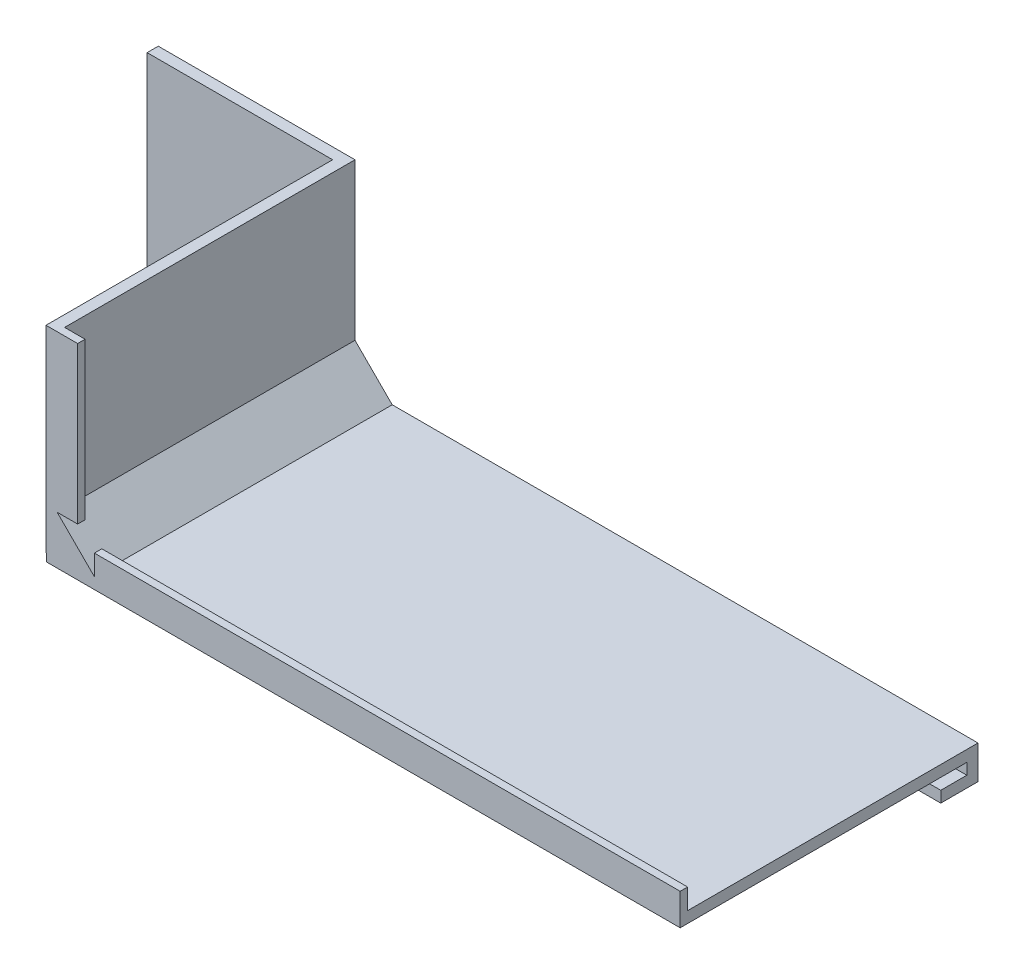
ISO-10303-21;
HEADER;
FILE_DESCRIPTION(('STEP AP214'),'2;1');
FILE_NAME('part.step','',(''),(''),'','','');
FILE_SCHEMA(('AUTOMOTIVE_DESIGN { 1 0 10303 214 1 1 1 1 }'));
ENDSEC;
DATA;
#1=APPLICATION_CONTEXT('core data for automotive mechanical design processes');
#2=APPLICATION_PROTOCOL_DEFINITION('international standard','automotive_design',2000,#1);
#3=PRODUCT_CONTEXT('',#1,'mechanical');
#4=PRODUCT('Part','Part','',(#3));
#5=PRODUCT_RELATED_PRODUCT_CATEGORY('part','',(#4));
#6=PRODUCT_DEFINITION_FORMATION('','',#4);
#7=PRODUCT_DEFINITION_CONTEXT('part definition',#1,'design');
#8=PRODUCT_DEFINITION('design','',#6,#7);
#9=PRODUCT_DEFINITION_SHAPE('','',#8);
#10=(LENGTH_UNIT() NAMED_UNIT(*) SI_UNIT(.MILLI.,.METRE.));
#11=(NAMED_UNIT(*) PLANE_ANGLE_UNIT() SI_UNIT($,.RADIAN.));
#12=(NAMED_UNIT(*) SI_UNIT($,.STERADIAN.) SOLID_ANGLE_UNIT());
#13=UNCERTAINTY_MEASURE_WITH_UNIT(LENGTH_MEASURE(1.E-05),#10,'distance_accuracy_value','');
#14=(GEOMETRIC_REPRESENTATION_CONTEXT(3) GLOBAL_UNCERTAINTY_ASSIGNED_CONTEXT((#13)) GLOBAL_UNIT_ASSIGNED_CONTEXT((#10,
#11,#12)) REPRESENTATION_CONTEXT('',''));
#15=CARTESIAN_POINT('',(0.,0.,0.));
#16=DIRECTION('',(0.,0.,1.));
#17=DIRECTION('',(1.,0.,0.));
#18=AXIS2_PLACEMENT_3D('',#15,#16,#17);
#19=CARTESIAN_POINT('',(0.,0.,-272.562777593547));
#20=DIRECTION('',(0.,0.,1.));
#21=DIRECTION('',(1.,0.,0.));
#22=AXIS2_PLACEMENT_3D('',#19,#20,#21);
#23=CYLINDRICAL_SURFACE('',#22,50.05);
#24=DIRECTION('',(0.,0.,1.));
#25=VECTOR('',#24,1.);
#26=CARTESIAN_POINT('',(49.7996234925526,-5.,-272.562777593547));
#27=LINE('',#26,#25);
#28=CARTESIAN_POINT('',(49.7996234925526,-5.,-131.));
#29=VERTEX_POINT('',#28);
#30=CARTESIAN_POINT('',(49.7996234925526,-5.,-128.));
#31=VERTEX_POINT('',#30);
#32=EDGE_CURVE('E408',#29,#31,#27,.T.);
#33=ORIENTED_EDGE('',*,*,#32,.T.);
#34=CARTESIAN_POINT('',(0.,0.,-128.));
#35=DIRECTION('',(0.,0.,-1.));
#36=DIRECTION('',(-1.,0.,0.));
#37=AXIS2_PLACEMENT_3D('',#34,#35,#36);
#38=CIRCLE('',#37,50.05);
#39=CARTESIAN_POINT('',(0.,-50.05,-128.));
#40=VERTEX_POINT('',#39);
#41=EDGE_CURVE('E204',#40,#31,#38,.F.);
#42=ORIENTED_EDGE('',*,*,#41,.F.);
#43=DIRECTION('',(0.,0.,1.));
#44=VECTOR('',#43,1.);
#45=CARTESIAN_POINT('',(0.,-50.05,-272.562777593547));
#46=LINE('',#45,#44);
#47=CARTESIAN_POINT('',(0.,-50.05,-131.));
#48=VERTEX_POINT('',#47);
#49=EDGE_CURVE('E57',#40,#48,#46,.F.);
#50=ORIENTED_EDGE('',*,*,#49,.T.);
#51=CARTESIAN_POINT('',(0.,0.,-131.));
#52=DIRECTION('',(0.,0.,-1.));
#53=DIRECTION('',(-1.,0.,0.));
#54=AXIS2_PLACEMENT_3D('',#51,#52,#53);
#55=CIRCLE('',#54,50.05);
#56=EDGE_CURVE('E211',#29,#48,#55,.T.);
#57=ORIENTED_EDGE('',*,*,#56,.F.);
#58=EDGE_LOOP('',(#33,#42,#50,#57));
#59=FACE_BOUND('',#58,.T.);
#60=ADVANCED_FACE('F48',(#59),#23,.T.);
#61=CARTESIAN_POINT('',(0.,4.,0.));
#62=DIRECTION('',(0.,-1.,0.));
#63=DIRECTION('',(0.,0.,-1.));
#64=AXIS2_PLACEMENT_3D('',#61,#62,#63);
#65=PLANE('',#64);
#66=DIRECTION('',(-1.,0.,0.));
#67=VECTOR('',#66,1.);
#68=CARTESIAN_POINT('',(0.,4.,-53.));
#69=LINE('',#68,#67);
#70=CARTESIAN_POINT('',(220.183732216023,4.,-53.));
#71=VERTEX_POINT('',#70);
#72=CARTESIAN_POINT('',(62.8397431775084,4.,-53.));
#73=VERTEX_POINT('',#72);
#74=EDGE_CURVE('E72',#71,#73,#69,.T.);
#75=ORIENTED_EDGE('',*,*,#74,.F.);
#76=DIRECTION('',(0.,0.,1.));
#77=VECTOR('',#76,1.);
#78=CARTESIAN_POINT('',(220.183732216023,4.,-9.99999999999999));
#79=LINE('',#78,#77);
#80=CARTESIAN_POINT('',(220.183732216023,4.,-131.));
#81=VERTEX_POINT('',#80);
#82=EDGE_CURVE('E240',#81,#71,#79,.T.);
#83=ORIENTED_EDGE('',*,*,#82,.F.);
#84=DIRECTION('',(1.,0.,0.));
#85=VECTOR('',#84,1.);
#86=CARTESIAN_POINT('',(39.7994974842648,4.,-131.));
#87=LINE('',#86,#85);
#88=CARTESIAN_POINT('',(62.8397431775084,4.,-131.));
#89=VERTEX_POINT('',#88);
#90=EDGE_CURVE('E236',#89,#81,#87,.T.);
#91=ORIENTED_EDGE('',*,*,#90,.F.);
#92=DIRECTION('',(0.,0.,1.));
#93=VECTOR('',#92,1.);
#94=CARTESIAN_POINT('',(62.8397431775084,4.,-11.5));
#95=LINE('',#94,#93);
#96=EDGE_CURVE('E247',#89,#73,#95,.T.);
#97=ORIENTED_EDGE('',*,*,#96,.T.);
#98=EDGE_LOOP('',(#75,#83,#91,#97));
#99=FACE_BOUND('',#98,.T.);
#100=ADVANCED_FACE('F381',(#99),#65,.F.);
#101=CARTESIAN_POINT('',(52.8397431775085,341.294854205715,134.));
#102=DIRECTION('',(-1.,0.,0.));
#103=DIRECTION('',(0.,0.,1.));
#104=AXIS2_PLACEMENT_3D('',#101,#102,#103);
#105=PLANE('',#104);
#106=DIRECTION('',(0.,1.,0.));
#107=VECTOR('',#106,1.);
#108=CARTESIAN_POINT('',(52.8397431775085,341.294854205715,-53.));
#109=LINE('',#108,#107);
#110=CARTESIAN_POINT('',(52.8397431775085,14.0000000000001,-53.));
#111=VERTEX_POINT('',#110);
#112=CARTESIAN_POINT('',(52.8397431775085,56.,-53.));
#113=VERTEX_POINT('',#112);
#114=EDGE_CURVE('E293',#111,#113,#109,.T.);
#115=ORIENTED_EDGE('',*,*,#114,.F.);
#116=DIRECTION('',(0.,0.,-1.));
#117=VECTOR('',#116,1.);
#118=CARTESIAN_POINT('',(52.8397431775085,14.0000000000001,-131.));
#119=LINE('',#118,#117);
#120=CARTESIAN_POINT('',(52.8397431775085,14.0000000000001,-131.));
#121=VERTEX_POINT('',#120);
#122=EDGE_CURVE('E243',#111,#121,#119,.T.);
#123=ORIENTED_EDGE('',*,*,#122,.T.);
#124=DIRECTION('',(0.,-1.,0.));
#125=VECTOR('',#124,1.);
#126=CARTESIAN_POINT('',(52.8397431775085,341.294854205715,-131.));
#127=LINE('',#126,#125);
#128=CARTESIAN_POINT('',(52.8397431775085,56.,-131.));
#129=VERTEX_POINT('',#128);
#130=EDGE_CURVE('E230',#129,#121,#127,.T.);
#131=ORIENTED_EDGE('',*,*,#130,.F.);
#132=DIRECTION('',(0.,0.,1.));
#133=VECTOR('',#132,1.);
#134=CARTESIAN_POINT('',(52.8397431775085,56.,134.));
#135=LINE('',#134,#133);
#136=EDGE_CURVE('E219',#129,#113,#135,.T.);
#137=ORIENTED_EDGE('',*,*,#136,.T.);
#138=EDGE_LOOP('',(#115,#123,#131,#137));
#139=FACE_BOUND('',#138,.T.);
#140=ADVANCED_FACE('F377',(#139),#105,.F.);
#141=CARTESIAN_POINT('',(0.,0.,-131.));
#142=DIRECTION('',(0.,0.,1.));
#143=DIRECTION('',(1.,0.,0.));
#144=AXIS2_PLACEMENT_3D('',#141,#142,#143);
#145=CYLINDRICAL_SURFACE('',#144,50.);
#146=CARTESIAN_POINT('',(0.,0.,-128.));
#147=DIRECTION('',(0.,0.,-1.));
#148=DIRECTION('',(-1.,0.,0.));
#149=AXIS2_PLACEMENT_3D('',#146,#147,#148);
#150=CIRCLE('',#149,50.);
#151=CARTESIAN_POINT('',(49.749371855331,-5.,-128.));
#152=VERTEX_POINT('',#151);
#153=CARTESIAN_POINT('',(49.9599839871872,-2.,-128.));
#154=VERTEX_POINT('',#153);
#155=EDGE_CURVE('E201',#152,#154,#150,.F.);
#156=ORIENTED_EDGE('',*,*,#155,.F.);
#157=DIRECTION('',(0.,0.,1.));
#158=VECTOR('',#157,1.);
#159=CARTESIAN_POINT('',(49.749371855331,-5.,-131.));
#160=LINE('',#159,#158);
#161=CARTESIAN_POINT('',(49.749371855331,-5.,-121.));
#162=VERTEX_POINT('',#161);
#163=EDGE_CURVE('E188',#152,#162,#160,.T.);
#164=ORIENTED_EDGE('',*,*,#163,.T.);
#165=CARTESIAN_POINT('',(0.,0.,-121.));
#166=DIRECTION('',(0.,0.,-1.));
#167=DIRECTION('',(1.,0.,0.));
#168=AXIS2_PLACEMENT_3D('',#165,#166,#167);
#169=CIRCLE('',#168,50.);
#170=CARTESIAN_POINT('',(49.9599839871872,-2.,-121.));
#171=VERTEX_POINT('',#170);
#172=EDGE_CURVE('E396',#171,#162,#169,.T.);
#173=ORIENTED_EDGE('',*,*,#172,.F.);
#174=DIRECTION('',(0.,0.,1.));
#175=VECTOR('',#174,1.);
#176=CARTESIAN_POINT('',(49.9599839871872,-2.,-131.));
#177=LINE('',#176,#175);
#178=EDGE_CURVE('E208',#171,#154,#177,.F.);
#179=ORIENTED_EDGE('',*,*,#178,.T.);
#180=EDGE_LOOP('',(#156,#164,#173,#179));
#181=FACE_BOUND('',#180,.T.);
#182=ADVANCED_FACE('F206',(#181),#145,.F.);
#183=DIRECTION('',(0.,0.,1.));
#184=VECTOR('',#183,1.);
#185=CARTESIAN_POINT('',(49.9899989998,1.,-131.));
#186=LINE('',#185,#184);
#187=CARTESIAN_POINT('',(49.9899989998,1.,-128.));
#188=VERTEX_POINT('',#187);
#189=CARTESIAN_POINT('',(49.9899989998,1.,-51.));
#190=VERTEX_POINT('',#189);
#191=EDGE_CURVE('E263',#188,#190,#186,.T.);
#192=ORIENTED_EDGE('',*,*,#191,.T.);
#193=CARTESIAN_POINT('',(0.,0.,-51.));
#194=DIRECTION('',(0.,0.,-1.));
#195=DIRECTION('',(0.,1.,0.));
#196=AXIS2_PLACEMENT_3D('',#193,#194,#195);
#197=CIRCLE('',#196,50.);
#198=CARTESIAN_POINT('',(49.8397431775085,4.,-51.));
#199=VERTEX_POINT('',#198);
#200=EDGE_CURVE('E286',#190,#199,#197,.F.);
#201=ORIENTED_EDGE('',*,*,#200,.T.);
#202=DIRECTION('',(0.,0.,1.));
#203=VECTOR('',#202,1.);
#204=CARTESIAN_POINT('',(49.8397431775085,4.,131.));
#205=LINE('',#204,#203);
#206=CARTESIAN_POINT('',(49.8397431775085,4.,-128.));
#207=VERTEX_POINT('',#206);
#208=EDGE_CURVE('E213',#207,#199,#205,.T.);
#209=ORIENTED_EDGE('',*,*,#208,.F.);
#210=EDGE_CURVE('E210',#188,#207,#150,.F.);
#211=ORIENTED_EDGE('',*,*,#210,.F.);
#212=EDGE_LOOP('',(#192,#201,#209,#211));
#213=FACE_BOUND('',#212,.T.);
#214=ADVANCED_FACE('F285',(#213),#145,.F.);
#215=CARTESIAN_POINT('',(49.8397431775085,341.294854205715,131.));
#216=DIRECTION('',(1.,0.,0.));
#217=DIRECTION('',(0.,0.,-1.));
#218=AXIS2_PLACEMENT_3D('',#215,#216,#217);
#219=PLANE('',#218);
#220=ORIENTED_EDGE('',*,*,#208,.T.);
#221=DIRECTION('',(0.,1.,0.));
#222=VECTOR('',#221,1.);
#223=CARTESIAN_POINT('',(49.8397431775085,341.294854205715,-51.));
#224=LINE('',#223,#222);
#225=CARTESIAN_POINT('',(49.8397431775085,56.,-51.));
#226=VERTEX_POINT('',#225);
#227=EDGE_CURVE('E288',#199,#226,#224,.T.);
#228=ORIENTED_EDGE('',*,*,#227,.T.);
#229=DIRECTION('',(0.,0.,-1.));
#230=VECTOR('',#229,1.);
#231=CARTESIAN_POINT('',(49.8397431775085,56.,131.));
#232=LINE('',#231,#230);
#233=CARTESIAN_POINT('',(49.8397431775085,56.,-128.));
#234=VERTEX_POINT('',#233);
#235=EDGE_CURVE('E222',#226,#234,#232,.T.);
#236=ORIENTED_EDGE('',*,*,#235,.T.);
#237=DIRECTION('',(0.,-1.,0.));
#238=VECTOR('',#237,1.);
#239=CARTESIAN_POINT('',(49.8397431775084,341.294854205715,-128.));
#240=LINE('',#239,#238);
#241=EDGE_CURVE('E220',#234,#207,#240,.T.);
#242=ORIENTED_EDGE('',*,*,#241,.T.);
#243=EDGE_LOOP('',(#220,#228,#236,#242));
#244=FACE_BOUND('',#243,.T.);
#245=ADVANCED_FACE('F281',(#244),#219,.F.);
#246=CARTESIAN_POINT('',(220.183732216023,4.,-9.99999999999999));
#247=DIRECTION('',(1.,0.,0.));
#248=DIRECTION('',(0.,0.,-1.));
#249=AXIS2_PLACEMENT_3D('',#246,#247,#248);
#250=PLANE('',#249);
#251=DIRECTION('',(0.,0.,1.));
#252=VECTOR('',#251,1.);
#253=CARTESIAN_POINT('',(220.183732216023,-5.,-121.));
#254=LINE('',#253,#252);
#255=CARTESIAN_POINT('',(220.183732216023,-5.,-131.));
#256=VERTEX_POINT('',#255);
#257=CARTESIAN_POINT('',(220.183732216023,-5.,-121.));
#258=VERTEX_POINT('',#257);
#259=EDGE_CURVE('E196',#256,#258,#254,.T.);
#260=ORIENTED_EDGE('',*,*,#259,.F.);
#261=DIRECTION('',(0.,-1.,0.));
#262=VECTOR('',#261,1.);
#263=CARTESIAN_POINT('',(220.183732216023,4.,-131.));
#264=LINE('',#263,#262);
#265=EDGE_CURVE('E237',#81,#256,#264,.T.);
#266=ORIENTED_EDGE('',*,*,#265,.F.);
#267=ORIENTED_EDGE('',*,*,#82,.T.);
#268=DIRECTION('',(0.,1.,0.));
#269=VECTOR('',#268,1.);
#270=CARTESIAN_POINT('',(220.183732216023,2.5,-53.));
#271=LINE('',#270,#269);
#272=CARTESIAN_POINT('',(220.183732216023,9.5,-53.));
#273=VERTEX_POINT('',#272);
#274=EDGE_CURVE('E326',#71,#273,#271,.T.);
#275=ORIENTED_EDGE('',*,*,#274,.T.);
#276=DIRECTION('',(0.,0.,1.));
#277=VECTOR('',#276,1.);
#278=CARTESIAN_POINT('',(220.183732216023,9.5,-53.));
#279=LINE('',#278,#277);
#280=CARTESIAN_POINT('',(220.183732216023,9.5,-51.));
#281=VERTEX_POINT('',#280);
#282=EDGE_CURVE('E314',#273,#281,#279,.T.);
#283=ORIENTED_EDGE('',*,*,#282,.T.);
#284=DIRECTION('',(0.,1.,0.));
#285=VECTOR('',#284,1.);
#286=CARTESIAN_POINT('',(220.183732216023,84.2150551607094,-51.));
#287=LINE('',#286,#285);
#288=CARTESIAN_POINT('',(220.183732216023,1.,-51.));
#289=VERTEX_POINT('',#288);
#290=EDGE_CURVE('E289',#289,#281,#287,.T.);
#291=ORIENTED_EDGE('',*,*,#290,.F.);
#292=DIRECTION('',(0.,0.,1.));
#293=VECTOR('',#292,1.);
#294=CARTESIAN_POINT('',(220.183732216023,1.,131.));
#295=LINE('',#294,#293);
#296=CARTESIAN_POINT('',(220.183732216023,1.,-128.));
#297=VERTEX_POINT('',#296);
#298=EDGE_CURVE('E300',#297,#289,#295,.T.);
#299=ORIENTED_EDGE('',*,*,#298,.F.);
#300=DIRECTION('',(0.,1.,0.));
#301=VECTOR('',#300,1.);
#302=CARTESIAN_POINT('',(220.183732216023,-5.,-128.));
#303=LINE('',#302,#301);
#304=CARTESIAN_POINT('',(220.183732216023,-2.,-128.));
#305=VERTEX_POINT('',#304);
#306=EDGE_CURVE('E227',#305,#297,#303,.T.);
#307=ORIENTED_EDGE('',*,*,#306,.F.);
#308=DIRECTION('',(0.,0.,1.));
#309=VECTOR('',#308,1.);
#310=CARTESIAN_POINT('',(220.183732216023,-2.,-128.));
#311=LINE('',#310,#309);
#312=CARTESIAN_POINT('',(220.183732216023,-2.,-121.));
#313=VERTEX_POINT('',#312);
#314=EDGE_CURVE('E402',#305,#313,#311,.T.);
#315=ORIENTED_EDGE('',*,*,#314,.T.);
#316=DIRECTION('',(0.,1.,0.));
#317=VECTOR('',#316,1.);
#318=CARTESIAN_POINT('',(220.183732216023,-6.,-121.));
#319=LINE('',#318,#317);
#320=EDGE_CURVE('E393',#258,#313,#319,.T.);
#321=ORIENTED_EDGE('',*,*,#320,.F.);
#322=EDGE_LOOP('',(#260,#266,#267,#275,#283,#291,#299,#307,#315,#321));
#323=FACE_BOUND('',#322,.T.);
#324=ADVANCED_FACE('F310',(#323),#250,.T.);
#325=CARTESIAN_POINT('',(0.,0.,-131.));
#326=DIRECTION('',(0.,0.,-1.));
#327=DIRECTION('',(-1.,0.,0.));
#328=AXIS2_PLACEMENT_3D('',#325,#326,#327);
#329=PLANE('',#328);
#330=DIRECTION('',(1.,0.,0.));
#331=VECTOR('',#330,1.);
#332=CARTESIAN_POINT('',(-0.001000000000001,-5.,-131.));
#333=LINE('',#332,#331);
#334=EDGE_CURVE('E406',#29,#256,#333,.T.);
#335=ORIENTED_EDGE('',*,*,#334,.F.);
#336=ORIENTED_EDGE('',*,*,#56,.T.);
#337=DIRECTION('',(0.,1.,0.));
#338=VECTOR('',#337,1.);
#339=CARTESIAN_POINT('',(0.,74.9278312200649,-131.));
#340=LINE('',#339,#338);
#341=CARTESIAN_POINT('',(0.,56.,-131.));
#342=VERTEX_POINT('',#341);
#343=EDGE_CURVE('E259',#48,#342,#340,.T.);
#344=ORIENTED_EDGE('',*,*,#343,.T.);
#345=DIRECTION('',(1.,0.,0.));
#346=VECTOR('',#345,1.);
#347=CARTESIAN_POINT('',(-52.8397431775085,56.,-131.));
#348=LINE('',#347,#346);
#349=EDGE_CURVE('E217',#342,#129,#348,.T.);
#350=ORIENTED_EDGE('',*,*,#349,.T.);
#351=ORIENTED_EDGE('',*,*,#130,.T.);
#352=DIRECTION('',(-0.707106781186543,0.707106781186552,0.));
#353=VECTOR('',#352,1.);
#354=CARTESIAN_POINT('',(52.8397431775085,14.0000000000001,-131.));
#355=LINE('',#354,#353);
#356=EDGE_CURVE('E249',#121,#89,#355,.F.);
#357=ORIENTED_EDGE('',*,*,#356,.T.);
#358=ORIENTED_EDGE('',*,*,#90,.T.);
#359=ORIENTED_EDGE('',*,*,#265,.T.);
#360=EDGE_LOOP('',(#335,#336,#344,#350,#351,#357,#358,#359));
#361=FACE_BOUND('',#360,.T.);
#362=ADVANCED_FACE('F379',(#361),#329,.T.);
#363=CARTESIAN_POINT('',(220.183732216023,-5.,-128.));
#364=DIRECTION('',(0.,0.,-1.));
#365=DIRECTION('',(-1.,0.,0.));
#366=AXIS2_PLACEMENT_3D('',#363,#364,#365);
#367=PLANE('',#366);
#368=DIRECTION('',(1.,0.,0.));
#369=VECTOR('',#368,1.);
#370=CARTESIAN_POINT('',(51.7652841898553,-5.,-128.));
#371=LINE('',#370,#369);
#372=EDGE_CURVE('E192',#152,#31,#371,.T.);
#373=ORIENTED_EDGE('',*,*,#372,.F.);
#374=ORIENTED_EDGE('',*,*,#155,.T.);
#375=DIRECTION('',(1.,0.,0.));
#376=VECTOR('',#375,1.);
#377=CARTESIAN_POINT('',(-0.001000000000001,-2.,-128.));
#378=LINE('',#377,#376);
#379=EDGE_CURVE('E400',#154,#305,#378,.T.);
#380=ORIENTED_EDGE('',*,*,#379,.T.);
#381=ORIENTED_EDGE('',*,*,#306,.T.);
#382=DIRECTION('',(1.,0.,0.));
#383=VECTOR('',#382,1.);
#384=CARTESIAN_POINT('',(0.,1.,-128.));
#385=LINE('',#384,#383);
#386=EDGE_CURVE('E267',#188,#297,#385,.T.);
#387=ORIENTED_EDGE('',*,*,#386,.F.);
#388=ORIENTED_EDGE('',*,*,#210,.T.);
#389=ORIENTED_EDGE('',*,*,#241,.F.);
#390=DIRECTION('',(-1.,0.,0.));
#391=VECTOR('',#390,1.);
#392=CARTESIAN_POINT('',(-49.8397431775085,56.,-128.));
#393=LINE('',#392,#391);
#394=CARTESIAN_POINT('',(0.,56.,-128.));
#395=VERTEX_POINT('',#394);
#396=EDGE_CURVE('E224',#234,#395,#393,.T.);
#397=ORIENTED_EDGE('',*,*,#396,.T.);
#398=DIRECTION('',(0.,-1.,0.));
#399=VECTOR('',#398,1.);
#400=CARTESIAN_POINT('',(0.,-5.,-128.));
#401=LINE('',#400,#399);
#402=EDGE_CURVE('E256',#395,#40,#401,.T.);
#403=ORIENTED_EDGE('',*,*,#402,.T.);
#404=ORIENTED_EDGE('',*,*,#41,.T.);
#405=EDGE_LOOP('',(#373,#374,#380,#381,#387,#388,#389,#397,#403,#404));
#406=FACE_BOUND('',#405,.T.);
#407=ADVANCED_FACE('F199',(#406),#367,.F.);
#408=CARTESIAN_POINT('',(42.9502503121069,56.,234.437492999377));
#409=DIRECTION('',(0.,-1.,0.));
#410=DIRECTION('',(0.,0.,-1.));
#411=AXIS2_PLACEMENT_3D('',#408,#409,#410);
#412=PLANE('',#411);
#413=DIRECTION('',(1.,0.,0.));
#414=VECTOR('',#413,1.);
#415=CARTESIAN_POINT('',(42.9502503121069,56.,-51.));
#416=LINE('',#415,#414);
#417=CARTESIAN_POINT('',(58.3397431775085,56.,-51.));
#418=VERTEX_POINT('',#417);
#419=EDGE_CURVE('E291',#226,#418,#416,.T.);
#420=ORIENTED_EDGE('',*,*,#419,.T.);
#421=DIRECTION('',(0.,0.,1.));
#422=VECTOR('',#421,1.);
#423=CARTESIAN_POINT('',(58.3397431775085,56.,-53.));
#424=LINE('',#423,#422);
#425=CARTESIAN_POINT('',(58.3397431775085,56.,-53.));
#426=VERTEX_POINT('',#425);
#427=EDGE_CURVE('E352',#426,#418,#424,.T.);
#428=ORIENTED_EDGE('',*,*,#427,.F.);
#429=DIRECTION('',(-1.,0.,0.));
#430=VECTOR('',#429,1.);
#431=CARTESIAN_POINT('',(51.3397431775085,56.,-53.));
#432=LINE('',#431,#430);
#433=EDGE_CURVE('E345',#426,#113,#432,.T.);
#434=ORIENTED_EDGE('',*,*,#433,.T.);
#435=ORIENTED_EDGE('',*,*,#136,.F.);
#436=ORIENTED_EDGE('',*,*,#349,.F.);
#437=DIRECTION('',(0.,0.,1.));
#438=VECTOR('',#437,1.);
#439=CARTESIAN_POINT('',(0.,56.,234.437492999377));
#440=LINE('',#439,#438);
#441=EDGE_CURVE('E260',#342,#395,#440,.T.);
#442=ORIENTED_EDGE('',*,*,#441,.T.);
#443=ORIENTED_EDGE('',*,*,#396,.F.);
#444=ORIENTED_EDGE('',*,*,#235,.F.);
#445=EDGE_LOOP('',(#420,#428,#434,#435,#436,#442,#443,#444));
#446=FACE_BOUND('',#445,.T.);
#447=ADVANCED_FACE('F273',(#446),#412,.F.);
#448=CARTESIAN_POINT('',(52.8397431775085,14.0000000000001,134.));
#449=DIRECTION('',(0.707106781186552,0.707106781186543,0.));
#450=DIRECTION('',(0.,0.,1.));
#451=AXIS2_PLACEMENT_3D('',#448,#449,#450);
#452=PLANE('',#451);
#453=CARTESIAN_POINT('',(52.8397431775085,14.0000000000001,-51.));
#454=VERTEX_POINT('',#453);
#455=EDGE_CURVE('E244',#454,#111,#119,.T.);
#456=ORIENTED_EDGE('',*,*,#455,.F.);
#457=DIRECTION('',(-0.707106781186543,0.707106781186552,0.));
#458=VECTOR('',#457,1.);
#459=CARTESIAN_POINT('',(52.8397431775085,14.0000000000001,-51.));
#460=LINE('',#459,#458);
#461=CARTESIAN_POINT('',(62.8397432160231,3.9999999614853,-51.));
#462=VERTEX_POINT('',#461);
#463=EDGE_CURVE('E298',#454,#462,#460,.F.);
#464=ORIENTED_EDGE('',*,*,#463,.T.);
#465=DIRECTION('',(0.,0.,1.));
#466=VECTOR('',#465,1.);
#467=CARTESIAN_POINT('',(62.8397432160231,3.99999996148531,134.));
#468=LINE('',#467,#466);
#469=EDGE_CURVE('E323',#462,#73,#468,.F.);
#470=ORIENTED_EDGE('',*,*,#469,.T.);
#471=ORIENTED_EDGE('',*,*,#96,.F.);
#472=ORIENTED_EDGE('',*,*,#356,.F.);
#473=ORIENTED_EDGE('',*,*,#122,.F.);
#474=EDGE_LOOP('',(#456,#464,#470,#471,#472,#473));
#475=FACE_BOUND('',#474,.T.);
#476=ADVANCED_FACE('F51',(#475),#452,.T.);
#477=CARTESIAN_POINT('',(0.,74.9278312200649,-131.));
#478=DIRECTION('',(1.,0.,0.));
#479=DIRECTION('',(0.,0.,-1.));
#480=AXIS2_PLACEMENT_3D('',#477,#478,#479);
#481=PLANE('',#480);
#482=ORIENTED_EDGE('',*,*,#343,.F.);
#483=ORIENTED_EDGE('',*,*,#49,.F.);
#484=ORIENTED_EDGE('',*,*,#402,.F.);
#485=ORIENTED_EDGE('',*,*,#441,.F.);
#486=EDGE_LOOP('',(#482,#483,#484,#485));
#487=FACE_BOUND('',#486,.T.);
#488=ADVANCED_FACE('F255',(#487),#481,.F.);
#489=CARTESIAN_POINT('',(0.,1.,131.));
#490=DIRECTION('',(0.,1.,0.));
#491=DIRECTION('',(0.,0.,1.));
#492=AXIS2_PLACEMENT_3D('',#489,#490,#491);
#493=PLANE('',#492);
#494=ORIENTED_EDGE('',*,*,#298,.T.);
#495=DIRECTION('',(-1.,0.,0.));
#496=VECTOR('',#495,1.);
#497=CARTESIAN_POINT('',(0.,1.,-51.));
#498=LINE('',#497,#496);
#499=EDGE_CURVE('E13',#289,#190,#498,.T.);
#500=ORIENTED_EDGE('',*,*,#499,.T.);
#501=ORIENTED_EDGE('',*,*,#191,.F.);
#502=ORIENTED_EDGE('',*,*,#386,.T.);
#503=EDGE_LOOP('',(#494,#500,#501,#502));
#504=FACE_BOUND('',#503,.T.);
#505=ADVANCED_FACE('F305',(#504),#493,.F.);
#506=CARTESIAN_POINT('',(-41.8162677839768,84.2150551607094,-51.));
#507=DIRECTION('',(0.,0.,-1.));
#508=DIRECTION('',(0.,1.,0.));
#509=AXIS2_PLACEMENT_3D('',#506,#507,#508);
#510=PLANE('',#509);
#511=ORIENTED_EDGE('',*,*,#290,.T.);
#512=DIRECTION('',(-1.,0.,0.));
#513=VECTOR('',#512,1.);
#514=CARTESIAN_POINT('',(220.183732216023,9.5,-51.));
#515=LINE('',#514,#513);
#516=CARTESIAN_POINT('',(62.8397432160231,9.49999999999998,-51.));
#517=VERTEX_POINT('',#516);
#518=EDGE_CURVE('E319',#281,#517,#515,.T.);
#519=ORIENTED_EDGE('',*,*,#518,.T.);
#520=DIRECTION('',(0.,-1.,0.));
#521=VECTOR('',#520,1.);
#522=CARTESIAN_POINT('',(62.8397432160231,2.49999999999998,-51.));
#523=LINE('',#522,#521);
#524=EDGE_CURVE('E321',#517,#462,#523,.T.);
#525=ORIENTED_EDGE('',*,*,#524,.T.);
#526=ORIENTED_EDGE('',*,*,#463,.F.);
#527=DIRECTION('',(1.,0.,0.));
#528=VECTOR('',#527,1.);
#529=CARTESIAN_POINT('',(51.3397431775085,14.0000000000001,-51.));
#530=LINE('',#529,#528);
#531=CARTESIAN_POINT('',(58.3397431775085,14.0000000000001,-51.));
#532=VERTEX_POINT('',#531);
#533=EDGE_CURVE('E338',#454,#532,#530,.T.);
#534=ORIENTED_EDGE('',*,*,#533,.T.);
#535=DIRECTION('',(0.,1.,0.));
#536=VECTOR('',#535,1.);
#537=CARTESIAN_POINT('',(58.3397431775085,56.,-51.));
#538=LINE('',#537,#536);
#539=EDGE_CURVE('E342',#532,#418,#538,.T.);
#540=ORIENTED_EDGE('',*,*,#539,.T.);
#541=ORIENTED_EDGE('',*,*,#419,.F.);
#542=ORIENTED_EDGE('',*,*,#227,.F.);
#543=ORIENTED_EDGE('',*,*,#200,.F.);
#544=ORIENTED_EDGE('',*,*,#499,.F.);
#545=EDGE_LOOP('',(#511,#519,#525,#526,#534,#540,#541,#542,#543,#544));
#546=FACE_BOUND('',#545,.T.);
#547=ADVANCED_FACE('F317',(#546),#510,.F.);
#548=CARTESIAN_POINT('',(0.,0.,-53.));
#549=DIRECTION('',(0.,0.,1.));
#550=DIRECTION('',(1.,0.,0.));
#551=AXIS2_PLACEMENT_3D('',#548,#549,#550);
#552=PLANE('',#551);
#553=DIRECTION('',(1.,0.,0.));
#554=VECTOR('',#553,1.);
#555=CARTESIAN_POINT('',(51.3397431775085,14.0000000000001,-53.));
#556=LINE('',#555,#554);
#557=CARTESIAN_POINT('',(58.3397431775085,14.0000000000001,-53.));
#558=VERTEX_POINT('',#557);
#559=EDGE_CURVE('E339',#111,#558,#556,.T.);
#560=ORIENTED_EDGE('',*,*,#559,.F.);
#561=ORIENTED_EDGE('',*,*,#114,.T.);
#562=ORIENTED_EDGE('',*,*,#433,.F.);
#563=DIRECTION('',(0.,1.,0.));
#564=VECTOR('',#563,1.);
#565=CARTESIAN_POINT('',(58.3397431775085,56.,-53.));
#566=LINE('',#565,#564);
#567=EDGE_CURVE('E341',#558,#426,#566,.T.);
#568=ORIENTED_EDGE('',*,*,#567,.F.);
#569=EDGE_LOOP('',(#560,#561,#562,#568));
#570=FACE_BOUND('',#569,.T.);
#571=ADVANCED_FACE('F361',(#570),#552,.F.);
#572=CARTESIAN_POINT('',(51.3397431775085,14.0000000000001,-53.));
#573=DIRECTION('',(0.,-1.,0.));
#574=DIRECTION('',(0.,0.,-1.));
#575=AXIS2_PLACEMENT_3D('',#572,#573,#574);
#576=PLANE('',#575);
#577=ORIENTED_EDGE('',*,*,#455,.T.);
#578=ORIENTED_EDGE('',*,*,#559,.T.);
#579=DIRECTION('',(0.,0.,1.));
#580=VECTOR('',#579,1.);
#581=CARTESIAN_POINT('',(58.3397431775085,14.0000000000001,-53.));
#582=LINE('',#581,#580);
#583=EDGE_CURVE('E348',#558,#532,#582,.T.);
#584=ORIENTED_EDGE('',*,*,#583,.T.);
#585=ORIENTED_EDGE('',*,*,#533,.F.);
#586=EDGE_LOOP('',(#577,#578,#584,#585));
#587=FACE_BOUND('',#586,.T.);
#588=ADVANCED_FACE('F371',(#587),#576,.T.);
#589=CARTESIAN_POINT('',(58.3397431775085,56.,-53.));
#590=DIRECTION('',(1.,0.,0.));
#591=DIRECTION('',(0.,0.,-1.));
#592=AXIS2_PLACEMENT_3D('',#589,#590,#591);
#593=PLANE('',#592);
#594=ORIENTED_EDGE('',*,*,#539,.F.);
#595=ORIENTED_EDGE('',*,*,#583,.F.);
#596=ORIENTED_EDGE('',*,*,#567,.T.);
#597=ORIENTED_EDGE('',*,*,#427,.T.);
#598=EDGE_LOOP('',(#594,#595,#596,#597));
#599=FACE_BOUND('',#598,.T.);
#600=ADVANCED_FACE('F368',(#599),#593,.T.);
#601=CARTESIAN_POINT('',(0.,0.,-53.));
#602=DIRECTION('',(0.,0.,1.));
#603=DIRECTION('',(1.,0.,0.));
#604=AXIS2_PLACEMENT_3D('',#601,#602,#603);
#605=PLANE('',#604);
#606=ORIENTED_EDGE('',*,*,#274,.F.);
#607=ORIENTED_EDGE('',*,*,#74,.T.);
#608=DIRECTION('',(0.,-1.,0.));
#609=VECTOR('',#608,1.);
#610=CARTESIAN_POINT('',(62.8397432160231,2.49999999999998,-53.));
#611=LINE('',#610,#609);
#612=CARTESIAN_POINT('',(62.8397432160231,9.49999999999998,-53.));
#613=VERTEX_POINT('',#612);
#614=EDGE_CURVE('E330',#613,#73,#611,.T.);
#615=ORIENTED_EDGE('',*,*,#614,.F.);
#616=DIRECTION('',(-1.,0.,0.));
#617=VECTOR('',#616,1.);
#618=CARTESIAN_POINT('',(220.183732216023,9.5,-53.));
#619=LINE('',#618,#617);
#620=EDGE_CURVE('E333',#273,#613,#619,.T.);
#621=ORIENTED_EDGE('',*,*,#620,.F.);
#622=EDGE_LOOP('',(#606,#607,#615,#621));
#623=FACE_BOUND('',#622,.T.);
#624=ADVANCED_FACE('F390',(#623),#605,.F.);
#625=CARTESIAN_POINT('',(62.8397432160231,2.49999999999998,-53.));
#626=DIRECTION('',(-1.,0.,0.));
#627=DIRECTION('',(0.,0.,1.));
#628=AXIS2_PLACEMENT_3D('',#625,#626,#627);
#629=PLANE('',#628);
#630=ORIENTED_EDGE('',*,*,#469,.F.);
#631=ORIENTED_EDGE('',*,*,#524,.F.);
#632=DIRECTION('',(0.,0.,1.));
#633=VECTOR('',#632,1.);
#634=CARTESIAN_POINT('',(62.8397432160231,9.49999999999998,-53.));
#635=LINE('',#634,#633);
#636=EDGE_CURVE('E386',#613,#517,#635,.T.);
#637=ORIENTED_EDGE('',*,*,#636,.F.);
#638=ORIENTED_EDGE('',*,*,#614,.T.);
#639=EDGE_LOOP('',(#630,#631,#637,#638));
#640=FACE_BOUND('',#639,.T.);
#641=ADVANCED_FACE('F384',(#640),#629,.T.);
#642=CARTESIAN_POINT('',(220.183732216023,9.5,-53.));
#643=DIRECTION('',(0.,1.,0.));
#644=DIRECTION('',(-1.,0.,0.));
#645=AXIS2_PLACEMENT_3D('',#642,#643,#644);
#646=PLANE('',#645);
#647=ORIENTED_EDGE('',*,*,#518,.F.);
#648=ORIENTED_EDGE('',*,*,#282,.F.);
#649=ORIENTED_EDGE('',*,*,#620,.T.);
#650=ORIENTED_EDGE('',*,*,#636,.T.);
#651=EDGE_LOOP('',(#647,#648,#649,#650));
#652=FACE_BOUND('',#651,.T.);
#653=ADVANCED_FACE('F391',(#652),#646,.T.);
#654=CARTESIAN_POINT('',(0.,0.,-121.));
#655=DIRECTION('',(0.,0.,1.));
#656=DIRECTION('',(1.,0.,0.));
#657=AXIS2_PLACEMENT_3D('',#654,#655,#656);
#658=PLANE('',#657);
#659=ORIENTED_EDGE('',*,*,#172,.T.);
#660=DIRECTION('',(1.,0.,0.));
#661=VECTOR('',#660,1.);
#662=CARTESIAN_POINT('',(-0.001000000000001,-5.,-121.));
#663=LINE('',#662,#661);
#664=EDGE_CURVE('E64',#162,#258,#663,.T.);
#665=ORIENTED_EDGE('',*,*,#664,.T.);
#666=ORIENTED_EDGE('',*,*,#320,.T.);
#667=DIRECTION('',(1.,0.,0.));
#668=VECTOR('',#667,1.);
#669=CARTESIAN_POINT('',(-0.001000000000001,-2.,-121.));
#670=LINE('',#669,#668);
#671=EDGE_CURVE('E399',#171,#313,#670,.T.);
#672=ORIENTED_EDGE('',*,*,#671,.F.);
#673=EDGE_LOOP('',(#659,#665,#666,#672));
#674=FACE_BOUND('',#673,.T.);
#675=ADVANCED_FACE('F413',(#674),#658,.T.);
#676=CARTESIAN_POINT('',(-0.001000000000001,-2.,-128.));
#677=DIRECTION('',(0.,1.,0.));
#678=DIRECTION('',(0.,0.,1.));
#679=AXIS2_PLACEMENT_3D('',#676,#677,#678);
#680=PLANE('',#679);
#681=ORIENTED_EDGE('',*,*,#178,.F.);
#682=ORIENTED_EDGE('',*,*,#671,.T.);
#683=ORIENTED_EDGE('',*,*,#314,.F.);
#684=ORIENTED_EDGE('',*,*,#379,.F.);
#685=EDGE_LOOP('',(#681,#682,#683,#684));
#686=FACE_BOUND('',#685,.T.);
#687=ADVANCED_FACE('F415',(#686),#680,.T.);
#688=CARTESIAN_POINT('',(-0.001000000000001,-5.,-121.));
#689=DIRECTION('',(0.,1.,0.));
#690=DIRECTION('',(0.,0.,1.));
#691=AXIS2_PLACEMENT_3D('',#688,#689,#690);
#692=PLANE('',#691);
#693=ORIENTED_EDGE('',*,*,#259,.T.);
#694=ORIENTED_EDGE('',*,*,#664,.F.);
#695=ORIENTED_EDGE('',*,*,#163,.F.);
#696=ORIENTED_EDGE('',*,*,#372,.T.);
#697=ORIENTED_EDGE('',*,*,#32,.F.);
#698=ORIENTED_EDGE('',*,*,#334,.T.);
#699=EDGE_LOOP('',(#693,#694,#695,#696,#697,#698));
#700=FACE_BOUND('',#699,.T.);
#701=ADVANCED_FACE('F190',(#700),#692,.F.);
#702=CLOSED_SHELL('',(#60,#100,#140,#182,#214,#245,#324,#362,#407,#447,#476,#488,#505,#547,#571,
#588,#600,#624,#641,#653,#675,#687,#701));
#703=MANIFOLD_SOLID_BREP('B2',#702);
#704=ADVANCED_BREP_SHAPE_REPRESENTATION('',(#18,#703),#14);
#705=SHAPE_DEFINITION_REPRESENTATION(#9,#704);
ENDSEC;
END-ISO-10303-21;
